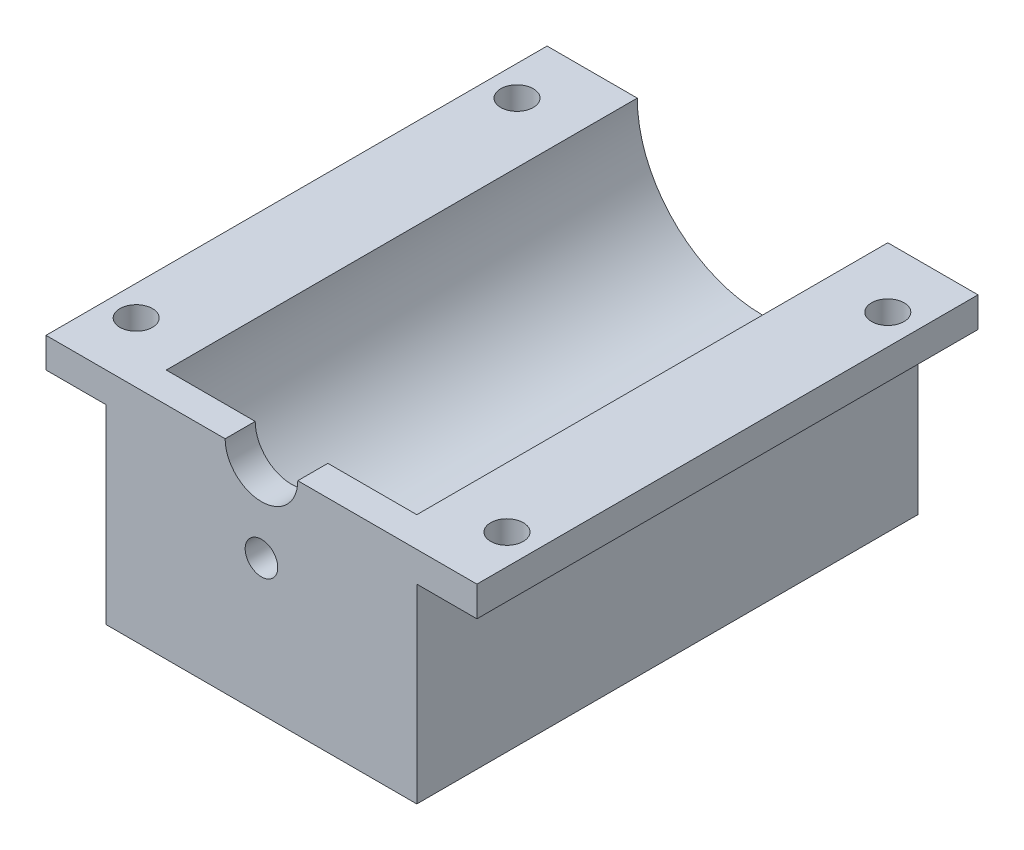
ISO-10303-21;
HEADER;
FILE_DESCRIPTION(('STEP AP214'),'2;1');
FILE_NAME('part.step','',(''),(''),'','','');
FILE_SCHEMA(('AUTOMOTIVE_DESIGN { 1 0 10303 214 1 1 1 1 }'));
ENDSEC;
DATA;
#1=APPLICATION_CONTEXT('core data for automotive mechanical design processes');
#2=APPLICATION_PROTOCOL_DEFINITION('international standard','automotive_design',2000,#1);
#3=PRODUCT_CONTEXT('',#1,'mechanical');
#4=PRODUCT('Part','Part','',(#3));
#5=PRODUCT_RELATED_PRODUCT_CATEGORY('part','',(#4));
#6=PRODUCT_DEFINITION_FORMATION('','',#4);
#7=PRODUCT_DEFINITION_CONTEXT('part definition',#1,'design');
#8=PRODUCT_DEFINITION('design','',#6,#7);
#9=PRODUCT_DEFINITION_SHAPE('','',#8);
#10=(LENGTH_UNIT() NAMED_UNIT(*) SI_UNIT(.MILLI.,.METRE.));
#11=(NAMED_UNIT(*) PLANE_ANGLE_UNIT() SI_UNIT($,.RADIAN.));
#12=(NAMED_UNIT(*) SI_UNIT($,.STERADIAN.) SOLID_ANGLE_UNIT());
#13=UNCERTAINTY_MEASURE_WITH_UNIT(LENGTH_MEASURE(1.E-05),#10,'distance_accuracy_value','');
#14=(GEOMETRIC_REPRESENTATION_CONTEXT(3) GLOBAL_UNCERTAINTY_ASSIGNED_CONTEXT((#13)) GLOBAL_UNIT_ASSIGNED_CONTEXT((#10,
#11,#12)) REPRESENTATION_CONTEXT('',''));
#15=CARTESIAN_POINT('',(0.,0.,0.));
#16=DIRECTION('',(0.,0.,1.));
#17=DIRECTION('',(1.,0.,0.));
#18=AXIS2_PLACEMENT_3D('',#15,#16,#17);
#19=CARTESIAN_POINT('',(15.5,22.,50.));
#20=DIRECTION('',(0.,0.,-1.));
#21=DIRECTION('',(-1.,0.,0.));
#22=AXIS2_PLACEMENT_3D('',#19,#20,#21);
#23=CYLINDRICAL_SURFACE('',#22,12.5);
#24=CARTESIAN_POINT('',(15.5,22.,47.));
#25=DIRECTION('',(0.,0.,1.));
#26=DIRECTION('',(1.,0.,0.));
#27=AXIS2_PLACEMENT_3D('',#24,#25,#26);
#28=CIRCLE('',#27,12.5);
#29=CARTESIAN_POINT('',(28.,22.,47.));
#30=VERTEX_POINT('',#29);
#31=CARTESIAN_POINT('',(3.,22.,47.));
#32=VERTEX_POINT('',#31);
#33=EDGE_CURVE('E11',#30,#32,#28,.F.);
#34=ORIENTED_EDGE('',*,*,#33,.F.);
#35=DIRECTION('',(0.,0.,-1.));
#36=VECTOR('',#35,1.);
#37=CARTESIAN_POINT('',(28.,22.,50.));
#38=LINE('',#37,#36);
#39=CARTESIAN_POINT('',(28.,22.,0.));
#40=VERTEX_POINT('',#39);
#41=EDGE_CURVE('E208',#30,#40,#38,.T.);
#42=ORIENTED_EDGE('',*,*,#41,.T.);
#43=CARTESIAN_POINT('',(15.5,22.,0.));
#44=DIRECTION('',(0.,0.,-1.));
#45=DIRECTION('',(1.,0.,0.));
#46=AXIS2_PLACEMENT_3D('',#43,#44,#45);
#47=CIRCLE('',#46,12.5);
#48=CARTESIAN_POINT('',(3.,22.,0.));
#49=VERTEX_POINT('',#48);
#50=EDGE_CURVE('E177',#40,#49,#47,.T.);
#51=ORIENTED_EDGE('',*,*,#50,.T.);
#52=DIRECTION('',(0.,0.,-1.));
#53=VECTOR('',#52,1.);
#54=CARTESIAN_POINT('',(3.,22.,50.));
#55=LINE('',#54,#53);
#56=EDGE_CURVE('E205',#32,#49,#55,.T.);
#57=ORIENTED_EDGE('',*,*,#56,.F.);
#58=EDGE_LOOP('',(#34,#42,#51,#57));
#59=FACE_BOUND('',#58,.T.);
#60=ADVANCED_FACE('F41',(#59),#23,.F.);
#61=CARTESIAN_POINT('',(31.,0.,50.));
#62=DIRECTION('',(-1.,0.,0.));
#63=DIRECTION('',(0.,0.,1.));
#64=AXIS2_PLACEMENT_3D('',#61,#62,#63);
#65=PLANE('',#64);
#66=DIRECTION('',(0.,1.,0.));
#67=VECTOR('',#66,1.);
#68=CARTESIAN_POINT('',(31.,0.,0.));
#69=LINE('',#68,#67);
#70=CARTESIAN_POINT('',(31.,0.,0.));
#71=VERTEX_POINT('',#70);
#72=CARTESIAN_POINT('',(31.,19.,0.));
#73=VERTEX_POINT('',#72);
#74=EDGE_CURVE('E162',#71,#73,#69,.T.);
#75=ORIENTED_EDGE('',*,*,#74,.T.);
#76=DIRECTION('',(0.,0.,-1.));
#77=VECTOR('',#76,1.);
#78=CARTESIAN_POINT('',(31.,19.,50.));
#79=LINE('',#78,#77);
#80=CARTESIAN_POINT('',(31.,19.,50.));
#81=VERTEX_POINT('',#80);
#82=EDGE_CURVE('E50',#81,#73,#79,.T.);
#83=ORIENTED_EDGE('',*,*,#82,.F.);
#84=DIRECTION('',(0.,1.,0.));
#85=VECTOR('',#84,1.);
#86=CARTESIAN_POINT('',(31.,0.,50.));
#87=LINE('',#86,#85);
#88=CARTESIAN_POINT('',(31.,0.,50.));
#89=VERTEX_POINT('',#88);
#90=EDGE_CURVE('E194',#89,#81,#87,.T.);
#91=ORIENTED_EDGE('',*,*,#90,.F.);
#92=DIRECTION('',(0.,0.,-1.));
#93=VECTOR('',#92,1.);
#94=CARTESIAN_POINT('',(31.,0.,50.));
#95=LINE('',#94,#93);
#96=EDGE_CURVE('E158',#89,#71,#95,.T.);
#97=ORIENTED_EDGE('',*,*,#96,.T.);
#98=EDGE_LOOP('',(#75,#83,#91,#97));
#99=FACE_BOUND('',#98,.T.);
#100=ADVANCED_FACE('F43',(#99),#65,.F.);
#101=CARTESIAN_POINT('',(31.,19.,50.));
#102=DIRECTION('',(0.,1.,0.));
#103=DIRECTION('',(0.,0.,1.));
#104=AXIS2_PLACEMENT_3D('',#101,#102,#103);
#105=PLANE('',#104);
#106=CARTESIAN_POINT('',(34.,19.,6.));
#107=DIRECTION('',(0.,1.,0.));
#108=DIRECTION('',(0.,0.,1.));
#109=AXIS2_PLACEMENT_3D('',#106,#107,#108);
#110=CIRCLE('',#109,1.625);
#111=CARTESIAN_POINT('',(34.,19.,7.625));
#112=VERTEX_POINT('',#111);
#113=EDGE_CURVE('E167',#112,#112,#110,.T.);
#114=ORIENTED_EDGE('',*,*,#113,.T.);
#115=EDGE_LOOP('',(#114));
#116=FACE_BOUND('',#115,.T.);
#117=CARTESIAN_POINT('',(34.,19.,44.));
#118=DIRECTION('',(0.,1.,0.));
#119=DIRECTION('',(0.,0.,1.));
#120=AXIS2_PLACEMENT_3D('',#117,#118,#119);
#121=CIRCLE('',#120,1.625);
#122=CARTESIAN_POINT('',(34.,19.,45.625));
#123=VERTEX_POINT('',#122);
#124=EDGE_CURVE('E228',#123,#123,#121,.T.);
#125=ORIENTED_EDGE('',*,*,#124,.T.);
#126=EDGE_LOOP('',(#125));
#127=FACE_BOUND('',#126,.T.);
#128=DIRECTION('',(1.,0.,0.));
#129=VECTOR('',#128,1.);
#130=CARTESIAN_POINT('',(31.,19.,0.));
#131=LINE('',#130,#129);
#132=CARTESIAN_POINT('',(37.,19.,0.));
#133=VERTEX_POINT('',#132);
#134=EDGE_CURVE('E166',#73,#133,#131,.T.);
#135=ORIENTED_EDGE('',*,*,#134,.T.);
#136=DIRECTION('',(0.,0.,-1.));
#137=VECTOR('',#136,1.);
#138=CARTESIAN_POINT('',(37.,19.,50.));
#139=LINE('',#138,#137);
#140=CARTESIAN_POINT('',(37.,19.,50.));
#141=VERTEX_POINT('',#140);
#142=EDGE_CURVE('E215',#141,#133,#139,.T.);
#143=ORIENTED_EDGE('',*,*,#142,.F.);
#144=DIRECTION('',(1.,0.,0.));
#145=VECTOR('',#144,1.);
#146=CARTESIAN_POINT('',(31.,19.,50.));
#147=LINE('',#146,#145);
#148=EDGE_CURVE('E112',#81,#141,#147,.T.);
#149=ORIENTED_EDGE('',*,*,#148,.F.);
#150=ORIENTED_EDGE('',*,*,#82,.T.);
#151=EDGE_LOOP('',(#135,#143,#149,#150));
#152=FACE_BOUND('',#151,.T.);
#153=ADVANCED_FACE('F275',(#116,#127,#152),#105,.F.);
#154=CARTESIAN_POINT('',(37.,19.,50.));
#155=DIRECTION('',(-1.,0.,0.));
#156=DIRECTION('',(0.,0.,1.));
#157=AXIS2_PLACEMENT_3D('',#154,#155,#156);
#158=PLANE('',#157);
#159=DIRECTION('',(0.,1.,0.));
#160=VECTOR('',#159,1.);
#161=CARTESIAN_POINT('',(37.,19.,0.));
#162=LINE('',#161,#160);
#163=CARTESIAN_POINT('',(37.,22.,0.));
#164=VERTEX_POINT('',#163);
#165=EDGE_CURVE('E170',#133,#164,#162,.T.);
#166=ORIENTED_EDGE('',*,*,#165,.T.);
#167=DIRECTION('',(0.,0.,-1.));
#168=VECTOR('',#167,1.);
#169=CARTESIAN_POINT('',(37.,22.,50.));
#170=LINE('',#169,#168);
#171=CARTESIAN_POINT('',(37.,22.,50.));
#172=VERTEX_POINT('',#171);
#173=EDGE_CURVE('E211',#172,#164,#170,.T.);
#174=ORIENTED_EDGE('',*,*,#173,.F.);
#175=DIRECTION('',(0.,1.,0.));
#176=VECTOR('',#175,1.);
#177=CARTESIAN_POINT('',(37.,19.,50.));
#178=LINE('',#177,#176);
#179=EDGE_CURVE('E246',#141,#172,#178,.T.);
#180=ORIENTED_EDGE('',*,*,#179,.F.);
#181=ORIENTED_EDGE('',*,*,#142,.T.);
#182=EDGE_LOOP('',(#166,#174,#180,#181));
#183=FACE_BOUND('',#182,.T.);
#184=ADVANCED_FACE('F278',(#183),#158,.F.);
#185=CARTESIAN_POINT('',(37.,22.,50.));
#186=DIRECTION('',(0.,-1.,0.));
#187=DIRECTION('',(0.,0.,-1.));
#188=AXIS2_PLACEMENT_3D('',#185,#186,#187);
#189=PLANE('',#188);
#190=CARTESIAN_POINT('',(34.,22.,6.));
#191=DIRECTION('',(0.,1.,0.));
#192=DIRECTION('',(0.,0.,1.));
#193=AXIS2_PLACEMENT_3D('',#190,#191,#192);
#194=CIRCLE('',#193,1.625);
#195=CARTESIAN_POINT('',(34.,22.,7.625));
#196=VERTEX_POINT('',#195);
#197=EDGE_CURVE('E328',#196,#196,#194,.T.);
#198=ORIENTED_EDGE('',*,*,#197,.F.);
#199=EDGE_LOOP('',(#198));
#200=FACE_BOUND('',#199,.T.);
#201=CARTESIAN_POINT('',(34.,22.,44.));
#202=DIRECTION('',(0.,1.,0.));
#203=DIRECTION('',(0.,0.,1.));
#204=AXIS2_PLACEMENT_3D('',#201,#202,#203);
#205=CIRCLE('',#204,1.625);
#206=CARTESIAN_POINT('',(34.,22.,45.625));
#207=VERTEX_POINT('',#206);
#208=EDGE_CURVE('E324',#207,#207,#205,.T.);
#209=ORIENTED_EDGE('',*,*,#208,.F.);
#210=EDGE_LOOP('',(#209));
#211=FACE_BOUND('',#210,.T.);
#212=DIRECTION('',(-1.,0.,0.));
#213=VECTOR('',#212,1.);
#214=CARTESIAN_POINT('',(37.,22.,0.));
#215=LINE('',#214,#213);
#216=EDGE_CURVE('E173',#164,#40,#215,.T.);
#217=ORIENTED_EDGE('',*,*,#216,.T.);
#218=ORIENTED_EDGE('',*,*,#41,.F.);
#219=DIRECTION('',(-1.,0.,0.));
#220=VECTOR('',#219,1.);
#221=CARTESIAN_POINT('',(19.125,22.,47.));
#222=LINE('',#221,#220);
#223=CARTESIAN_POINT('',(19.125,22.,47.));
#224=VERTEX_POINT('',#223);
#225=EDGE_CURVE('E300',#30,#224,#222,.T.);
#226=ORIENTED_EDGE('',*,*,#225,.T.);
#227=DIRECTION('',(0.,0.,1.));
#228=VECTOR('',#227,1.);
#229=CARTESIAN_POINT('',(19.125,22.,47.));
#230=LINE('',#229,#228);
#231=CARTESIAN_POINT('',(19.125,22.,50.));
#232=VERTEX_POINT('',#231);
#233=EDGE_CURVE('E287',#224,#232,#230,.T.);
#234=ORIENTED_EDGE('',*,*,#233,.T.);
#235=DIRECTION('',(-1.,0.,0.));
#236=VECTOR('',#235,1.);
#237=CARTESIAN_POINT('',(37.,22.,50.));
#238=LINE('',#237,#236);
#239=EDGE_CURVE('E249',#172,#232,#238,.T.);
#240=ORIENTED_EDGE('',*,*,#239,.F.);
#241=ORIENTED_EDGE('',*,*,#173,.T.);
#242=EDGE_LOOP('',(#217,#218,#226,#234,#240,#241));
#243=FACE_BOUND('',#242,.T.);
#244=ADVANCED_FACE('F283',(#200,#211,#243),#189,.F.);
#245=CARTESIAN_POINT('',(-6.,22.,50.));
#246=DIRECTION('',(0.,-1.,0.));
#247=DIRECTION('',(0.,0.,-1.));
#248=AXIS2_PLACEMENT_3D('',#245,#246,#247);
#249=PLANE('',#248);
#250=CARTESIAN_POINT('',(-3.,22.,6.));
#251=DIRECTION('',(0.,1.,0.));
#252=DIRECTION('',(0.,0.,1.));
#253=AXIS2_PLACEMENT_3D('',#250,#251,#252);
#254=CIRCLE('',#253,1.625);
#255=CARTESIAN_POINT('',(-3.,22.,7.625));
#256=VERTEX_POINT('',#255);
#257=EDGE_CURVE('E321',#256,#256,#254,.T.);
#258=ORIENTED_EDGE('',*,*,#257,.F.);
#259=EDGE_LOOP('',(#258));
#260=FACE_BOUND('',#259,.T.);
#261=CARTESIAN_POINT('',(-3.,22.,44.));
#262=DIRECTION('',(0.,1.,0.));
#263=DIRECTION('',(0.,0.,1.));
#264=AXIS2_PLACEMENT_3D('',#261,#262,#263);
#265=CIRCLE('',#264,1.625);
#266=CARTESIAN_POINT('',(-3.,22.,45.625));
#267=VERTEX_POINT('',#266);
#268=EDGE_CURVE('E225',#267,#267,#265,.T.);
#269=ORIENTED_EDGE('',*,*,#268,.F.);
#270=EDGE_LOOP('',(#269));
#271=FACE_BOUND('',#270,.T.);
#272=DIRECTION('',(-1.,0.,0.));
#273=VECTOR('',#272,1.);
#274=CARTESIAN_POINT('',(-6.,22.,0.));
#275=LINE('',#274,#273);
#276=CARTESIAN_POINT('',(-6.,22.,0.));
#277=VERTEX_POINT('',#276);
#278=EDGE_CURVE('E181',#49,#277,#275,.T.);
#279=ORIENTED_EDGE('',*,*,#278,.T.);
#280=DIRECTION('',(0.,0.,-1.));
#281=VECTOR('',#280,1.);
#282=CARTESIAN_POINT('',(-6.,22.,50.));
#283=LINE('',#282,#281);
#284=CARTESIAN_POINT('',(-6.,22.,50.));
#285=VERTEX_POINT('',#284);
#286=EDGE_CURVE('E201',#285,#277,#283,.T.);
#287=ORIENTED_EDGE('',*,*,#286,.F.);
#288=DIRECTION('',(-1.,0.,0.));
#289=VECTOR('',#288,1.);
#290=CARTESIAN_POINT('',(-6.,22.,50.));
#291=LINE('',#290,#289);
#292=CARTESIAN_POINT('',(11.875,22.,50.));
#293=VERTEX_POINT('',#292);
#294=EDGE_CURVE('E252',#293,#285,#291,.T.);
#295=ORIENTED_EDGE('',*,*,#294,.F.);
#296=DIRECTION('',(0.,0.,1.));
#297=VECTOR('',#296,1.);
#298=CARTESIAN_POINT('',(11.875,22.,47.));
#299=LINE('',#298,#297);
#300=CARTESIAN_POINT('',(11.875,22.,47.));
#301=VERTEX_POINT('',#300);
#302=EDGE_CURVE('E318',#301,#293,#299,.T.);
#303=ORIENTED_EDGE('',*,*,#302,.F.);
#304=DIRECTION('',(-1.,0.,0.));
#305=VECTOR('',#304,1.);
#306=CARTESIAN_POINT('',(3.,21.9999999999999,47.));
#307=LINE('',#306,#305);
#308=EDGE_CURVE('E57',#301,#32,#307,.T.);
#309=ORIENTED_EDGE('',*,*,#308,.T.);
#310=ORIENTED_EDGE('',*,*,#56,.T.);
#311=EDGE_LOOP('',(#279,#287,#295,#303,#309,#310));
#312=FACE_BOUND('',#311,.T.);
#313=ADVANCED_FACE('F261',(#260,#271,#312),#249,.F.);
#314=CARTESIAN_POINT('',(-6.,19.,50.));
#315=DIRECTION('',(1.,0.,0.));
#316=DIRECTION('',(0.,0.,-1.));
#317=AXIS2_PLACEMENT_3D('',#314,#315,#316);
#318=PLANE('',#317);
#319=DIRECTION('',(0.,-1.,0.));
#320=VECTOR('',#319,1.);
#321=CARTESIAN_POINT('',(-6.,19.,0.));
#322=LINE('',#321,#320);
#323=CARTESIAN_POINT('',(-6.,19.,0.));
#324=VERTEX_POINT('',#323);
#325=EDGE_CURVE('E184',#277,#324,#322,.T.);
#326=ORIENTED_EDGE('',*,*,#325,.T.);
#327=DIRECTION('',(0.,0.,-1.));
#328=VECTOR('',#327,1.);
#329=CARTESIAN_POINT('',(-6.,19.,50.));
#330=LINE('',#329,#328);
#331=CARTESIAN_POINT('',(-6.,19.,50.));
#332=VERTEX_POINT('',#331);
#333=EDGE_CURVE('E151',#332,#324,#330,.T.);
#334=ORIENTED_EDGE('',*,*,#333,.F.);
#335=DIRECTION('',(0.,-1.,0.));
#336=VECTOR('',#335,1.);
#337=CARTESIAN_POINT('',(-6.,19.,50.));
#338=LINE('',#337,#336);
#339=EDGE_CURVE('E137',#285,#332,#338,.T.);
#340=ORIENTED_EDGE('',*,*,#339,.F.);
#341=ORIENTED_EDGE('',*,*,#286,.T.);
#342=EDGE_LOOP('',(#326,#334,#340,#341));
#343=FACE_BOUND('',#342,.T.);
#344=ADVANCED_FACE('F265',(#343),#318,.F.);
#345=CARTESIAN_POINT('',(-6.,19.,50.));
#346=DIRECTION('',(0.,1.,0.));
#347=DIRECTION('',(0.,0.,1.));
#348=AXIS2_PLACEMENT_3D('',#345,#346,#347);
#349=PLANE('',#348);
#350=CARTESIAN_POINT('',(-3.,19.,6.));
#351=DIRECTION('',(0.,1.,0.));
#352=DIRECTION('',(0.,0.,1.));
#353=AXIS2_PLACEMENT_3D('',#350,#351,#352);
#354=CIRCLE('',#353,1.625);
#355=CARTESIAN_POINT('',(-3.,19.,7.625));
#356=VERTEX_POINT('',#355);
#357=EDGE_CURVE('E224',#356,#356,#354,.T.);
#358=ORIENTED_EDGE('',*,*,#357,.T.);
#359=EDGE_LOOP('',(#358));
#360=FACE_BOUND('',#359,.T.);
#361=CARTESIAN_POINT('',(-3.,19.,44.));
#362=DIRECTION('',(0.,1.,0.));
#363=DIRECTION('',(0.,0.,1.));
#364=AXIS2_PLACEMENT_3D('',#361,#362,#363);
#365=CIRCLE('',#364,1.625);
#366=CARTESIAN_POINT('',(-3.,19.,45.625));
#367=VERTEX_POINT('',#366);
#368=EDGE_CURVE('E221',#367,#367,#365,.T.);
#369=ORIENTED_EDGE('',*,*,#368,.T.);
#370=EDGE_LOOP('',(#369));
#371=FACE_BOUND('',#370,.T.);
#372=DIRECTION('',(1.,0.,0.));
#373=VECTOR('',#372,1.);
#374=CARTESIAN_POINT('',(-6.,19.,0.));
#375=LINE('',#374,#373);
#376=CARTESIAN_POINT('',(0.,19.,0.));
#377=VERTEX_POINT('',#376);
#378=EDGE_CURVE('E147',#324,#377,#375,.T.);
#379=ORIENTED_EDGE('',*,*,#378,.T.);
#380=DIRECTION('',(0.,0.,-1.));
#381=VECTOR('',#380,1.);
#382=CARTESIAN_POINT('',(0.,19.,50.));
#383=LINE('',#382,#381);
#384=CARTESIAN_POINT('',(0.,19.,50.));
#385=VERTEX_POINT('',#384);
#386=EDGE_CURVE('E144',#385,#377,#383,.T.);
#387=ORIENTED_EDGE('',*,*,#386,.F.);
#388=DIRECTION('',(1.,0.,0.));
#389=VECTOR('',#388,1.);
#390=CARTESIAN_POINT('',(-6.,19.,50.));
#391=LINE('',#390,#389);
#392=EDGE_CURVE('E128',#332,#385,#391,.T.);
#393=ORIENTED_EDGE('',*,*,#392,.F.);
#394=ORIENTED_EDGE('',*,*,#333,.T.);
#395=EDGE_LOOP('',(#379,#387,#393,#394));
#396=FACE_BOUND('',#395,.T.);
#397=ADVANCED_FACE('F145',(#360,#371,#396),#349,.F.);
#398=CARTESIAN_POINT('',(0.,19.,50.));
#399=DIRECTION('',(1.,0.,0.));
#400=DIRECTION('',(0.,1.,0.));
#401=AXIS2_PLACEMENT_3D('',#398,#399,#400);
#402=PLANE('',#401);
#403=DIRECTION('',(0.,-1.,0.));
#404=VECTOR('',#403,1.);
#405=CARTESIAN_POINT('',(0.,19.,0.));
#406=LINE('',#405,#404);
#407=CARTESIAN_POINT('',(0.,0.,0.));
#408=VERTEX_POINT('',#407);
#409=EDGE_CURVE('E189',#377,#408,#406,.T.);
#410=ORIENTED_EDGE('',*,*,#409,.T.);
#411=DIRECTION('',(0.,0.,-1.));
#412=VECTOR('',#411,1.);
#413=CARTESIAN_POINT('',(0.,0.,50.));
#414=LINE('',#413,#412);
#415=CARTESIAN_POINT('',(0.,0.,50.));
#416=VERTEX_POINT('',#415);
#417=EDGE_CURVE('E152',#416,#408,#414,.T.);
#418=ORIENTED_EDGE('',*,*,#417,.F.);
#419=DIRECTION('',(0.,-1.,0.));
#420=VECTOR('',#419,1.);
#421=CARTESIAN_POINT('',(0.,19.,50.));
#422=LINE('',#421,#420);
#423=EDGE_CURVE('E134',#385,#416,#422,.T.);
#424=ORIENTED_EDGE('',*,*,#423,.F.);
#425=ORIENTED_EDGE('',*,*,#386,.T.);
#426=EDGE_LOOP('',(#410,#418,#424,#425));
#427=FACE_BOUND('',#426,.T.);
#428=ADVANCED_FACE('F154',(#427),#402,.F.);
#429=CARTESIAN_POINT('',(0.,0.,50.));
#430=DIRECTION('',(0.,1.,0.));
#431=DIRECTION('',(0.,0.,1.));
#432=AXIS2_PLACEMENT_3D('',#429,#430,#431);
#433=PLANE('',#432);
#434=DIRECTION('',(1.,0.,0.));
#435=VECTOR('',#434,1.);
#436=CARTESIAN_POINT('',(0.,0.,0.));
#437=LINE('',#436,#435);
#438=EDGE_CURVE('E103',#408,#71,#437,.T.);
#439=ORIENTED_EDGE('',*,*,#438,.T.);
#440=ORIENTED_EDGE('',*,*,#96,.F.);
#441=DIRECTION('',(1.,0.,0.));
#442=VECTOR('',#441,1.);
#443=CARTESIAN_POINT('',(0.,0.,50.));
#444=LINE('',#443,#442);
#445=EDGE_CURVE('E65',#416,#89,#444,.T.);
#446=ORIENTED_EDGE('',*,*,#445,.F.);
#447=ORIENTED_EDGE('',*,*,#417,.T.);
#448=EDGE_LOOP('',(#439,#440,#446,#447));
#449=FACE_BOUND('',#448,.T.);
#450=ADVANCED_FACE('F269',(#449),#433,.F.);
#451=CARTESIAN_POINT('',(15.5,22.,50.));
#452=DIRECTION('',(0.,0.,1.));
#453=DIRECTION('',(1.,0.,0.));
#454=AXIS2_PLACEMENT_3D('',#451,#452,#453);
#455=PLANE('',#454);
#456=ORIENTED_EDGE('',*,*,#239,.T.);
#457=CARTESIAN_POINT('',(15.5,22.,50.));
#458=DIRECTION('',(0.,0.,-1.));
#459=DIRECTION('',(1.,0.,0.));
#460=AXIS2_PLACEMENT_3D('',#457,#458,#459);
#461=CIRCLE('',#460,3.625);
#462=EDGE_CURVE('E259',#232,#293,#461,.T.);
#463=ORIENTED_EDGE('',*,*,#462,.T.);
#464=ORIENTED_EDGE('',*,*,#294,.T.);
#465=ORIENTED_EDGE('',*,*,#339,.T.);
#466=ORIENTED_EDGE('',*,*,#392,.T.);
#467=ORIENTED_EDGE('',*,*,#423,.T.);
#468=ORIENTED_EDGE('',*,*,#445,.T.);
#469=ORIENTED_EDGE('',*,*,#90,.T.);
#470=ORIENTED_EDGE('',*,*,#148,.T.);
#471=ORIENTED_EDGE('',*,*,#179,.T.);
#472=EDGE_LOOP('',(#456,#463,#464,#465,#466,#467,#468,#469,#470,#471));
#473=FACE_BOUND('',#472,.T.);
#474=CARTESIAN_POINT('',(15.4999999999999,13.5,50.));
#475=DIRECTION('',(0.,0.,1.));
#476=DIRECTION('',(1.,0.,0.));
#477=AXIS2_PLACEMENT_3D('',#474,#475,#476);
#478=CIRCLE('',#477,1.625);
#479=CARTESIAN_POINT('',(17.1249999999999,13.5,50.));
#480=VERTEX_POINT('',#479);
#481=EDGE_CURVE('E313',#480,#480,#478,.T.);
#482=ORIENTED_EDGE('',*,*,#481,.F.);
#483=EDGE_LOOP('',(#482));
#484=FACE_BOUND('',#483,.T.);
#485=ADVANCED_FACE('F131',(#473,#484),#455,.T.);
#486=CARTESIAN_POINT('',(15.5,22.,0.));
#487=DIRECTION('',(0.,0.,1.));
#488=DIRECTION('',(1.,0.,0.));
#489=AXIS2_PLACEMENT_3D('',#486,#487,#488);
#490=PLANE('',#489);
#491=ORIENTED_EDGE('',*,*,#74,.F.);
#492=ORIENTED_EDGE('',*,*,#438,.F.);
#493=ORIENTED_EDGE('',*,*,#409,.F.);
#494=ORIENTED_EDGE('',*,*,#378,.F.);
#495=ORIENTED_EDGE('',*,*,#325,.F.);
#496=ORIENTED_EDGE('',*,*,#278,.F.);
#497=ORIENTED_EDGE('',*,*,#50,.F.);
#498=ORIENTED_EDGE('',*,*,#216,.F.);
#499=ORIENTED_EDGE('',*,*,#165,.F.);
#500=ORIENTED_EDGE('',*,*,#134,.F.);
#501=EDGE_LOOP('',(#491,#492,#493,#494,#495,#496,#497,#498,#499,#500));
#502=FACE_BOUND('',#501,.T.);
#503=ADVANCED_FACE('F268',(#502),#490,.F.);
#504=CARTESIAN_POINT('',(-3.,-28.,44.));
#505=DIRECTION('',(0.,1.,0.));
#506=DIRECTION('',(0.,0.,1.));
#507=AXIS2_PLACEMENT_3D('',#504,#505,#506);
#508=CYLINDRICAL_SURFACE('',#507,1.625);
#509=ORIENTED_EDGE('',*,*,#268,.T.);
#510=EDGE_LOOP('',(#509));
#511=FACE_BOUND('',#510,.T.);
#512=ORIENTED_EDGE('',*,*,#368,.F.);
#513=EDGE_LOOP('',(#512));
#514=FACE_BOUND('',#513,.T.);
#515=ADVANCED_FACE('F345',(#511,#514),#508,.F.);
#516=CARTESIAN_POINT('',(-3.,-28.,6.));
#517=DIRECTION('',(0.,1.,0.));
#518=DIRECTION('',(0.,0.,1.));
#519=AXIS2_PLACEMENT_3D('',#516,#517,#518);
#520=CYLINDRICAL_SURFACE('',#519,1.625);
#521=ORIENTED_EDGE('',*,*,#257,.T.);
#522=EDGE_LOOP('',(#521));
#523=FACE_BOUND('',#522,.T.);
#524=ORIENTED_EDGE('',*,*,#357,.F.);
#525=EDGE_LOOP('',(#524));
#526=FACE_BOUND('',#525,.T.);
#527=ADVANCED_FACE('F335',(#523,#526),#520,.F.);
#528=CARTESIAN_POINT('',(34.,-28.,44.));
#529=DIRECTION('',(0.,1.,0.));
#530=DIRECTION('',(0.,0.,1.));
#531=AXIS2_PLACEMENT_3D('',#528,#529,#530);
#532=CYLINDRICAL_SURFACE('',#531,1.625);
#533=ORIENTED_EDGE('',*,*,#208,.T.);
#534=EDGE_LOOP('',(#533));
#535=FACE_BOUND('',#534,.T.);
#536=ORIENTED_EDGE('',*,*,#124,.F.);
#537=EDGE_LOOP('',(#536));
#538=FACE_BOUND('',#537,.T.);
#539=ADVANCED_FACE('F377',(#535,#538),#532,.F.);
#540=CARTESIAN_POINT('',(34.,-28.,6.));
#541=DIRECTION('',(0.,1.,0.));
#542=DIRECTION('',(0.,0.,1.));
#543=AXIS2_PLACEMENT_3D('',#540,#541,#542);
#544=CYLINDRICAL_SURFACE('',#543,1.625);
#545=ORIENTED_EDGE('',*,*,#197,.T.);
#546=EDGE_LOOP('',(#545));
#547=FACE_BOUND('',#546,.T.);
#548=ORIENTED_EDGE('',*,*,#113,.F.);
#549=EDGE_LOOP('',(#548));
#550=FACE_BOUND('',#549,.T.);
#551=ADVANCED_FACE('F375',(#547,#550),#544,.F.);
#552=CARTESIAN_POINT('',(15.5,22.,47.));
#553=DIRECTION('',(0.,0.,1.));
#554=DIRECTION('',(1.,0.,0.));
#555=AXIS2_PLACEMENT_3D('',#552,#553,#554);
#556=PLANE('',#555);
#557=CARTESIAN_POINT('',(15.4999999999999,13.5,47.));
#558=DIRECTION('',(0.,0.,1.));
#559=DIRECTION('',(1.,0.,0.));
#560=AXIS2_PLACEMENT_3D('',#557,#558,#559);
#561=CIRCLE('',#560,1.625);
#562=CARTESIAN_POINT('',(17.1249999999999,13.5,47.));
#563=VERTEX_POINT('',#562);
#564=EDGE_CURVE('E310',#563,#563,#561,.T.);
#565=ORIENTED_EDGE('',*,*,#564,.T.);
#566=EDGE_LOOP('',(#565));
#567=FACE_BOUND('',#566,.T.);
#568=ORIENTED_EDGE('',*,*,#225,.F.);
#569=ORIENTED_EDGE('',*,*,#33,.T.);
#570=ORIENTED_EDGE('',*,*,#308,.F.);
#571=CARTESIAN_POINT('',(15.5,22.,47.));
#572=DIRECTION('',(0.,0.,-1.));
#573=DIRECTION('',(1.,0.,0.));
#574=AXIS2_PLACEMENT_3D('',#571,#572,#573);
#575=CIRCLE('',#574,3.625);
#576=EDGE_CURVE('E303',#224,#301,#575,.T.);
#577=ORIENTED_EDGE('',*,*,#576,.F.);
#578=EDGE_LOOP('',(#568,#569,#570,#577));
#579=FACE_BOUND('',#578,.T.);
#580=ADVANCED_FACE('F301',(#567,#579),#556,.F.);
#581=CARTESIAN_POINT('',(15.5,22.,47.));
#582=DIRECTION('',(0.,0.,1.));
#583=DIRECTION('',(1.,0.,0.));
#584=AXIS2_PLACEMENT_3D('',#581,#582,#583);
#585=CYLINDRICAL_SURFACE('',#584,3.625);
#586=ORIENTED_EDGE('',*,*,#462,.F.);
#587=ORIENTED_EDGE('',*,*,#233,.F.);
#588=ORIENTED_EDGE('',*,*,#576,.T.);
#589=ORIENTED_EDGE('',*,*,#302,.T.);
#590=EDGE_LOOP('',(#586,#587,#588,#589));
#591=FACE_BOUND('',#590,.T.);
#592=ADVANCED_FACE('F384',(#591),#585,.F.);
#593=CARTESIAN_POINT('',(15.4999999999999,13.5,47.));
#594=DIRECTION('',(0.,0.,1.));
#595=DIRECTION('',(1.,0.,0.));
#596=AXIS2_PLACEMENT_3D('',#593,#594,#595);
#597=CYLINDRICAL_SURFACE('',#596,1.625);
#598=ORIENTED_EDGE('',*,*,#564,.F.);
#599=EDGE_LOOP('',(#598));
#600=FACE_BOUND('',#599,.T.);
#601=ORIENTED_EDGE('',*,*,#481,.T.);
#602=EDGE_LOOP('',(#601));
#603=FACE_BOUND('',#602,.T.);
#604=ADVANCED_FACE('F471',(#600,#603),#597,.F.);
#605=CLOSED_SHELL('',(#60,#100,#153,#184,#244,#313,#344,#397,#428,#450,#485,#503,#515,#527,#539,
#551,#580,#592,#604));
#606=MANIFOLD_SOLID_BREP('B2',#605);
#607=ADVANCED_BREP_SHAPE_REPRESENTATION('',(#18,#606),#14);
#608=SHAPE_DEFINITION_REPRESENTATION(#9,#607);
ENDSEC;
END-ISO-10303-21;
